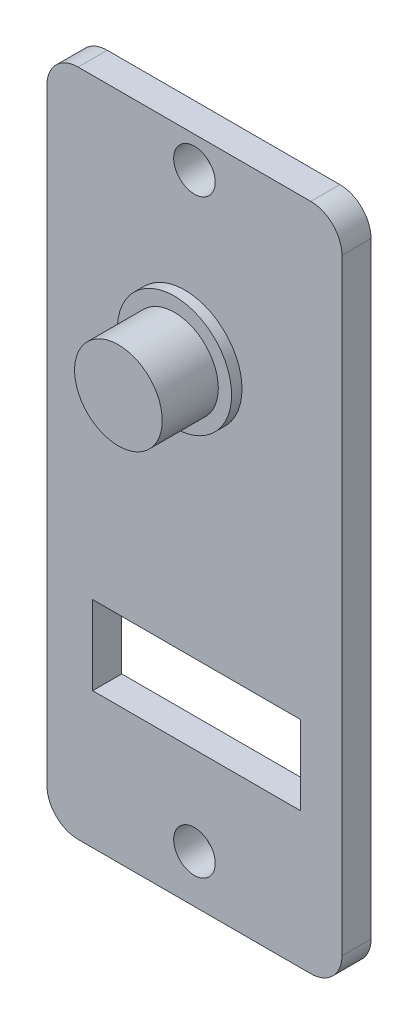
ISO-10303-21;
HEADER;
FILE_DESCRIPTION(('STEP AP214'),'2;1');
FILE_NAME('part.step','',(''),(''),'','','');
FILE_SCHEMA(('AUTOMOTIVE_DESIGN { 1 0 10303 214 1 1 1 1 }'));
ENDSEC;
DATA;
#1=APPLICATION_CONTEXT('core data for automotive mechanical design processes');
#2=APPLICATION_PROTOCOL_DEFINITION('international standard','automotive_design',2000,#1);
#3=PRODUCT_CONTEXT('',#1,'mechanical');
#4=PRODUCT('Part','Part','',(#3));
#5=PRODUCT_RELATED_PRODUCT_CATEGORY('part','',(#4));
#6=PRODUCT_DEFINITION_FORMATION('','',#4);
#7=PRODUCT_DEFINITION_CONTEXT('part definition',#1,'design');
#8=PRODUCT_DEFINITION('design','',#6,#7);
#9=PRODUCT_DEFINITION_SHAPE('','',#8);
#10=(LENGTH_UNIT() NAMED_UNIT(*) SI_UNIT(.MILLI.,.METRE.));
#11=(NAMED_UNIT(*) PLANE_ANGLE_UNIT() SI_UNIT($,.RADIAN.));
#12=(NAMED_UNIT(*) SI_UNIT($,.STERADIAN.) SOLID_ANGLE_UNIT());
#13=UNCERTAINTY_MEASURE_WITH_UNIT(LENGTH_MEASURE(1.E-05),#10,'distance_accuracy_value','');
#14=(GEOMETRIC_REPRESENTATION_CONTEXT(3) GLOBAL_UNCERTAINTY_ASSIGNED_CONTEXT((#13)) GLOBAL_UNIT_ASSIGNED_CONTEXT((#10,
#11,#12)) REPRESENTATION_CONTEXT('',''));
#15=CARTESIAN_POINT('',(0.,0.,0.));
#16=DIRECTION('',(0.,0.,1.));
#17=DIRECTION('',(1.,0.,0.));
#18=AXIS2_PLACEMENT_3D('',#15,#16,#17);
#19=CARTESIAN_POINT('',(-106.694153380275,235.753192448117,6.4));
#20=DIRECTION('',(1.,0.,0.));
#21=DIRECTION('',(0.,0.,-1.));
#22=AXIS2_PLACEMENT_3D('',#19,#20,#21);
#23=PLANE('',#22);
#24=DIRECTION('',(0.,-1.,0.));
#25=VECTOR('',#24,1.);
#26=CARTESIAN_POINT('',(-106.694153380275,235.753192448117,5.));
#27=LINE('',#26,#25);
#28=CARTESIAN_POINT('',(-106.694153380275,234.253192448117,5.));
#29=VERTEX_POINT('',#28);
#30=CARTESIAN_POINT('',(-106.694153380275,205.053192448117,5.));
#31=VERTEX_POINT('',#30);
#32=EDGE_CURVE('E188',#29,#31,#27,.T.);
#33=ORIENTED_EDGE('',*,*,#32,.T.);
#34=DIRECTION('',(0.,0.,-1.));
#35=VECTOR('',#34,1.);
#36=CARTESIAN_POINT('',(-106.694153380275,205.053192448117,6.4));
#37=LINE('',#36,#35);
#38=CARTESIAN_POINT('',(-106.694153380275,205.053192448117,6.4));
#39=VERTEX_POINT('',#38);
#40=EDGE_CURVE('E214',#31,#39,#37,.F.);
#41=ORIENTED_EDGE('',*,*,#40,.T.);
#42=DIRECTION('',(0.,-1.,0.));
#43=VECTOR('',#42,1.);
#44=CARTESIAN_POINT('',(-106.694153380275,235.753192448117,6.4));
#45=LINE('',#44,#43);
#46=CARTESIAN_POINT('',(-106.694153380275,234.253192448117,6.4));
#47=VERTEX_POINT('',#46);
#48=EDGE_CURVE('E176',#47,#39,#45,.T.);
#49=ORIENTED_EDGE('',*,*,#48,.F.);
#50=DIRECTION('',(0.,0.,-1.));
#51=VECTOR('',#50,1.);
#52=CARTESIAN_POINT('',(-106.694153380275,234.253192448117,6.4));
#53=LINE('',#52,#51);
#54=EDGE_CURVE('E211',#47,#29,#53,.T.);
#55=ORIENTED_EDGE('',*,*,#54,.T.);
#56=EDGE_LOOP('',(#33,#41,#49,#55));
#57=FACE_BOUND('',#56,.T.);
#58=ADVANCED_FACE('F38',(#57),#23,.F.);
#59=CARTESIAN_POINT('',(-106.694153380275,203.553192448117,6.4));
#60=DIRECTION('',(0.,1.,0.));
#61=DIRECTION('',(0.,0.,1.));
#62=AXIS2_PLACEMENT_3D('',#59,#60,#61);
#63=PLANE('',#62);
#64=DIRECTION('',(1.,0.,0.));
#65=VECTOR('',#64,1.);
#66=CARTESIAN_POINT('',(-106.694153380275,203.553192448117,6.4));
#67=LINE('',#66,#65);
#68=CARTESIAN_POINT('',(-105.194153380275,203.553192448117,6.4));
#69=VERTEX_POINT('',#68);
#70=CARTESIAN_POINT('',(-93.9941533802748,203.553192448117,6.4));
#71=VERTEX_POINT('',#70);
#72=EDGE_CURVE('E179',#69,#71,#67,.T.);
#73=ORIENTED_EDGE('',*,*,#72,.F.);
#74=DIRECTION('',(0.,0.,-1.));
#75=VECTOR('',#74,1.);
#76=CARTESIAN_POINT('',(-105.194153380275,203.553192448117,6.4));
#77=LINE('',#76,#75);
#78=CARTESIAN_POINT('',(-105.194153380275,203.553192448117,5.));
#79=VERTEX_POINT('',#78);
#80=EDGE_CURVE('E200',#69,#79,#77,.T.);
#81=ORIENTED_EDGE('',*,*,#80,.T.);
#82=DIRECTION('',(1.,0.,0.));
#83=VECTOR('',#82,1.);
#84=CARTESIAN_POINT('',(-106.694153380275,203.553192448117,5.));
#85=LINE('',#84,#83);
#86=CARTESIAN_POINT('',(-93.9941533802748,203.553192448117,5.));
#87=VERTEX_POINT('',#86);
#88=EDGE_CURVE('E191',#79,#87,#85,.T.);
#89=ORIENTED_EDGE('',*,*,#88,.T.);
#90=DIRECTION('',(0.,0.,-1.));
#91=VECTOR('',#90,1.);
#92=CARTESIAN_POINT('',(-93.9941533802748,203.553192448117,6.4));
#93=LINE('',#92,#91);
#94=EDGE_CURVE('E187',#87,#71,#93,.F.);
#95=ORIENTED_EDGE('',*,*,#94,.T.);
#96=EDGE_LOOP('',(#73,#81,#89,#95));
#97=FACE_BOUND('',#96,.T.);
#98=ADVANCED_FACE('F256',(#97),#63,.F.);
#99=CARTESIAN_POINT('',(-92.4941533802748,235.753192448117,6.4));
#100=DIRECTION('',(-1.,0.,0.));
#101=DIRECTION('',(0.,0.,1.));
#102=AXIS2_PLACEMENT_3D('',#99,#100,#101);
#103=PLANE('',#102);
#104=DIRECTION('',(0.,1.,0.));
#105=VECTOR('',#104,1.);
#106=CARTESIAN_POINT('',(-92.4941533802748,235.753192448117,6.4));
#107=LINE('',#106,#105);
#108=CARTESIAN_POINT('',(-92.4941533802748,205.053192448117,6.4));
#109=VERTEX_POINT('',#108);
#110=CARTESIAN_POINT('',(-92.4941533802748,234.253192448117,6.4));
#111=VERTEX_POINT('',#110);
#112=EDGE_CURVE('E183',#109,#111,#107,.T.);
#113=ORIENTED_EDGE('',*,*,#112,.F.);
#114=DIRECTION('',(0.,0.,-1.));
#115=VECTOR('',#114,1.);
#116=CARTESIAN_POINT('',(-92.4941533802748,205.053192448117,6.4));
#117=LINE('',#116,#115);
#118=CARTESIAN_POINT('',(-92.4941533802748,205.053192448117,5.));
#119=VERTEX_POINT('',#118);
#120=EDGE_CURVE('E225',#109,#119,#117,.T.);
#121=ORIENTED_EDGE('',*,*,#120,.T.);
#122=DIRECTION('',(0.,1.,0.));
#123=VECTOR('',#122,1.);
#124=CARTESIAN_POINT('',(-92.4941533802748,235.753192448117,5.));
#125=LINE('',#124,#123);
#126=CARTESIAN_POINT('',(-92.4941533802748,234.253192448117,5.));
#127=VERTEX_POINT('',#126);
#128=EDGE_CURVE('E195',#119,#127,#125,.T.);
#129=ORIENTED_EDGE('',*,*,#128,.T.);
#130=DIRECTION('',(0.,0.,-1.));
#131=VECTOR('',#130,1.);
#132=CARTESIAN_POINT('',(-92.4941533802748,234.253192448117,6.4));
#133=LINE('',#132,#131);
#134=EDGE_CURVE('E223',#127,#111,#133,.F.);
#135=ORIENTED_EDGE('',*,*,#134,.T.);
#136=EDGE_LOOP('',(#113,#121,#129,#135));
#137=FACE_BOUND('',#136,.T.);
#138=ADVANCED_FACE('F232',(#137),#103,.F.);
#139=CARTESIAN_POINT('',(-106.694153380275,235.753192448117,6.4));
#140=DIRECTION('',(0.,-1.,0.));
#141=DIRECTION('',(0.,0.,-1.));
#142=AXIS2_PLACEMENT_3D('',#139,#140,#141);
#143=PLANE('',#142);
#144=DIRECTION('',(-1.,0.,0.));
#145=VECTOR('',#144,1.);
#146=CARTESIAN_POINT('',(-106.694153380275,235.753192448117,6.4));
#147=LINE('',#146,#145);
#148=CARTESIAN_POINT('',(-93.9941533802748,235.753192448117,6.4));
#149=VERTEX_POINT('',#148);
#150=CARTESIAN_POINT('',(-105.194153380275,235.753192448117,6.4));
#151=VERTEX_POINT('',#150);
#152=EDGE_CURVE('E185',#149,#151,#147,.T.);
#153=ORIENTED_EDGE('',*,*,#152,.F.);
#154=DIRECTION('',(0.,0.,-1.));
#155=VECTOR('',#154,1.);
#156=CARTESIAN_POINT('',(-93.9941533802748,235.753192448117,6.4));
#157=LINE('',#156,#155);
#158=CARTESIAN_POINT('',(-93.9941533802748,235.753192448117,5.));
#159=VERTEX_POINT('',#158);
#160=EDGE_CURVE('E11',#149,#159,#157,.T.);
#161=ORIENTED_EDGE('',*,*,#160,.T.);
#162=DIRECTION('',(-1.,0.,0.));
#163=VECTOR('',#162,1.);
#164=CARTESIAN_POINT('',(-106.694153380275,235.753192448117,5.));
#165=LINE('',#164,#163);
#166=CARTESIAN_POINT('',(-105.194153380275,235.753192448117,5.));
#167=VERTEX_POINT('',#166);
#168=EDGE_CURVE('E180',#159,#167,#165,.T.);
#169=ORIENTED_EDGE('',*,*,#168,.T.);
#170=DIRECTION('',(0.,0.,-1.));
#171=VECTOR('',#170,1.);
#172=CARTESIAN_POINT('',(-105.194153380275,235.753192448117,6.4));
#173=LINE('',#172,#171);
#174=EDGE_CURVE('E47',#167,#151,#173,.F.);
#175=ORIENTED_EDGE('',*,*,#174,.T.);
#176=EDGE_LOOP('',(#153,#161,#169,#175));
#177=FACE_BOUND('',#176,.T.);
#178=ADVANCED_FACE('F241',(#177),#143,.F.);
#179=CARTESIAN_POINT('',(0.,0.,6.4));
#180=DIRECTION('',(0.,0.,1.));
#181=DIRECTION('',(1.,0.,0.));
#182=AXIS2_PLACEMENT_3D('',#179,#180,#181);
#183=PLANE('',#182);
#184=CARTESIAN_POINT('',(-100.056084645838,226.274312915593,6.4));
#185=DIRECTION('',(0.,0.,1.));
#186=DIRECTION('',(1.,0.,0.));
#187=AXIS2_PLACEMENT_3D('',#184,#185,#186);
#188=CIRCLE('',#187,2.75000000000001);
#189=CARTESIAN_POINT('',(-97.3060846458382,226.274312915593,6.4));
#190=VERTEX_POINT('',#189);
#191=EDGE_CURVE('E326',#190,#190,#188,.T.);
#192=ORIENTED_EDGE('',*,*,#191,.F.);
#193=EDGE_LOOP('',(#192));
#194=FACE_BOUND('',#193,.T.);
#195=CARTESIAN_POINT('',(-99.5941533802748,234.253192448117,6.4));
#196=DIRECTION('',(0.,0.,1.));
#197=DIRECTION('',(1.,0.,0.));
#198=AXIS2_PLACEMENT_3D('',#195,#196,#197);
#199=CIRCLE('',#198,1.00000000000001);
#200=CARTESIAN_POINT('',(-98.5941533802748,234.253192448117,6.4));
#201=VERTEX_POINT('',#200);
#202=EDGE_CURVE('E335',#201,#201,#199,.T.);
#203=ORIENTED_EDGE('',*,*,#202,.F.);
#204=EDGE_LOOP('',(#203));
#205=FACE_BOUND('',#204,.T.);
#206=CARTESIAN_POINT('',(-99.5941533802748,205.853192448117,6.4));
#207=DIRECTION('',(0.,0.,1.));
#208=DIRECTION('',(1.,0.,0.));
#209=AXIS2_PLACEMENT_3D('',#206,#207,#208);
#210=CIRCLE('',#209,0.999999999999998);
#211=CARTESIAN_POINT('',(-98.5941533802748,205.853192448117,6.4));
#212=VERTEX_POINT('',#211);
#213=EDGE_CURVE('E160',#212,#212,#210,.T.);
#214=ORIENTED_EDGE('',*,*,#213,.F.);
#215=EDGE_LOOP('',(#214));
#216=FACE_BOUND('',#215,.T.);
#217=DIRECTION('',(0.,-1.,0.));
#218=VECTOR('',#217,1.);
#219=CARTESIAN_POINT('',(-104.494153380275,213.903192448117,6.4));
#220=LINE('',#219,#218);
#221=CARTESIAN_POINT('',(-104.494153380275,213.903192448117,6.4));
#222=VERTEX_POINT('',#221);
#223=CARTESIAN_POINT('',(-104.494153380275,210.103192448117,6.4));
#224=VERTEX_POINT('',#223);
#225=EDGE_CURVE('E136',#222,#224,#220,.T.);
#226=ORIENTED_EDGE('',*,*,#225,.F.);
#227=DIRECTION('',(-1.,0.,0.));
#228=VECTOR('',#227,1.);
#229=CARTESIAN_POINT('',(-104.494153380275,213.903192448117,6.4));
#230=LINE('',#229,#228);
#231=CARTESIAN_POINT('',(-94.4941533802748,213.903192448117,6.4));
#232=VERTEX_POINT('',#231);
#233=EDGE_CURVE('E154',#232,#222,#230,.T.);
#234=ORIENTED_EDGE('',*,*,#233,.F.);
#235=DIRECTION('',(0.,1.,0.));
#236=VECTOR('',#235,1.);
#237=CARTESIAN_POINT('',(-94.4941533802748,213.903192448117,6.4));
#238=LINE('',#237,#236);
#239=CARTESIAN_POINT('',(-94.4941533802748,210.103192448117,6.4));
#240=VERTEX_POINT('',#239);
#241=EDGE_CURVE('E157',#240,#232,#238,.T.);
#242=ORIENTED_EDGE('',*,*,#241,.F.);
#243=DIRECTION('',(1.,0.,0.));
#244=VECTOR('',#243,1.);
#245=CARTESIAN_POINT('',(-104.494153380275,210.103192448117,6.4));
#246=LINE('',#245,#244);
#247=EDGE_CURVE('E166',#224,#240,#246,.T.);
#248=ORIENTED_EDGE('',*,*,#247,.F.);
#249=EDGE_LOOP('',(#226,#234,#242,#248));
#250=FACE_BOUND('',#249,.T.);
#251=ORIENTED_EDGE('',*,*,#48,.T.);
#252=CARTESIAN_POINT('',(-105.194153380275,205.053192448117,6.4));
#253=DIRECTION('',(0.,0.,1.));
#254=DIRECTION('',(1.,0.,0.));
#255=AXIS2_PLACEMENT_3D('',#252,#253,#254);
#256=CIRCLE('',#255,1.5);
#257=EDGE_CURVE('E221',#39,#69,#256,.T.);
#258=ORIENTED_EDGE('',*,*,#257,.T.);
#259=ORIENTED_EDGE('',*,*,#72,.T.);
#260=CARTESIAN_POINT('',(-93.9941533802748,205.053192448117,6.4));
#261=DIRECTION('',(0.,0.,1.));
#262=DIRECTION('',(1.,0.,0.));
#263=AXIS2_PLACEMENT_3D('',#260,#261,#262);
#264=CIRCLE('',#263,1.5);
#265=EDGE_CURVE('E219',#71,#109,#264,.T.);
#266=ORIENTED_EDGE('',*,*,#265,.T.);
#267=ORIENTED_EDGE('',*,*,#112,.T.);
#268=CARTESIAN_POINT('',(-93.9941533802748,234.253192448117,6.4));
#269=DIRECTION('',(0.,0.,1.));
#270=DIRECTION('',(1.,0.,0.));
#271=AXIS2_PLACEMENT_3D('',#268,#269,#270);
#272=CIRCLE('',#271,1.5);
#273=EDGE_CURVE('E60',#111,#149,#272,.T.);
#274=ORIENTED_EDGE('',*,*,#273,.T.);
#275=ORIENTED_EDGE('',*,*,#152,.T.);
#276=CARTESIAN_POINT('',(-105.194153380275,234.253192448117,6.4));
#277=DIRECTION('',(0.,0.,1.));
#278=DIRECTION('',(1.,0.,0.));
#279=AXIS2_PLACEMENT_3D('',#276,#277,#278);
#280=CIRCLE('',#279,1.5);
#281=EDGE_CURVE('E216',#151,#47,#280,.T.);
#282=ORIENTED_EDGE('',*,*,#281,.T.);
#283=EDGE_LOOP('',(#251,#258,#259,#266,#267,#274,#275,#282));
#284=FACE_BOUND('',#283,.T.);
#285=ADVANCED_FACE('F243',(#194,#205,#216,#250,#284),#183,.T.);
#286=CARTESIAN_POINT('',(0.,0.,5.));
#287=DIRECTION('',(0.,0.,1.));
#288=DIRECTION('',(1.,0.,0.));
#289=AXIS2_PLACEMENT_3D('',#286,#287,#288);
#290=PLANE('',#289);
#291=CARTESIAN_POINT('',(-99.5941533802748,234.253192448117,5.));
#292=DIRECTION('',(0.,0.,1.));
#293=DIRECTION('',(1.,0.,0.));
#294=AXIS2_PLACEMENT_3D('',#291,#292,#293);
#295=CIRCLE('',#294,1.00000000000001);
#296=CARTESIAN_POINT('',(-98.5941533802748,234.253192448117,5.));
#297=VERTEX_POINT('',#296);
#298=EDGE_CURVE('E192',#297,#297,#295,.T.);
#299=ORIENTED_EDGE('',*,*,#298,.T.);
#300=EDGE_LOOP('',(#299));
#301=FACE_BOUND('',#300,.T.);
#302=CARTESIAN_POINT('',(-99.5941533802748,205.853192448117,5.));
#303=DIRECTION('',(0.,0.,1.));
#304=DIRECTION('',(1.,0.,0.));
#305=AXIS2_PLACEMENT_3D('',#302,#303,#304);
#306=CIRCLE('',#305,0.999999999999998);
#307=CARTESIAN_POINT('',(-98.5941533802748,205.853192448117,5.));
#308=VERTEX_POINT('',#307);
#309=EDGE_CURVE('E337',#308,#308,#306,.T.);
#310=ORIENTED_EDGE('',*,*,#309,.T.);
#311=EDGE_LOOP('',(#310));
#312=FACE_BOUND('',#311,.T.);
#313=DIRECTION('',(-1.,0.,0.));
#314=VECTOR('',#313,1.);
#315=CARTESIAN_POINT('',(-104.494153380275,213.903192448117,5.));
#316=LINE('',#315,#314);
#317=CARTESIAN_POINT('',(-94.4941533802748,213.903192448117,5.));
#318=VERTEX_POINT('',#317);
#319=CARTESIAN_POINT('',(-104.494153380275,213.903192448117,5.));
#320=VERTEX_POINT('',#319);
#321=EDGE_CURVE('E141',#318,#320,#316,.T.);
#322=ORIENTED_EDGE('',*,*,#321,.T.);
#323=DIRECTION('',(0.,-1.,0.));
#324=VECTOR('',#323,1.);
#325=CARTESIAN_POINT('',(-104.494153380275,213.903192448117,5.));
#326=LINE('',#325,#324);
#327=CARTESIAN_POINT('',(-104.494153380275,210.103192448117,5.));
#328=VERTEX_POINT('',#327);
#329=EDGE_CURVE('E133',#320,#328,#326,.T.);
#330=ORIENTED_EDGE('',*,*,#329,.T.);
#331=DIRECTION('',(1.,0.,0.));
#332=VECTOR('',#331,1.);
#333=CARTESIAN_POINT('',(-104.494153380275,210.103192448117,5.));
#334=LINE('',#333,#332);
#335=CARTESIAN_POINT('',(-94.4941533802748,210.103192448117,5.));
#336=VERTEX_POINT('',#335);
#337=EDGE_CURVE('E145',#328,#336,#334,.T.);
#338=ORIENTED_EDGE('',*,*,#337,.T.);
#339=DIRECTION('',(0.,1.,0.));
#340=VECTOR('',#339,1.);
#341=CARTESIAN_POINT('',(-94.4941533802748,213.903192448117,5.));
#342=LINE('',#341,#340);
#343=EDGE_CURVE('E149',#336,#318,#342,.T.);
#344=ORIENTED_EDGE('',*,*,#343,.T.);
#345=EDGE_LOOP('',(#322,#330,#338,#344));
#346=FACE_BOUND('',#345,.T.);
#347=ORIENTED_EDGE('',*,*,#88,.F.);
#348=CARTESIAN_POINT('',(-105.194153380275,205.053192448117,5.));
#349=DIRECTION('',(0.,0.,1.));
#350=DIRECTION('',(1.,0.,0.));
#351=AXIS2_PLACEMENT_3D('',#348,#349,#350);
#352=CIRCLE('',#351,1.5);
#353=EDGE_CURVE('E209',#79,#31,#352,.F.);
#354=ORIENTED_EDGE('',*,*,#353,.T.);
#355=ORIENTED_EDGE('',*,*,#32,.F.);
#356=CARTESIAN_POINT('',(-105.194153380275,234.253192448117,5.));
#357=DIRECTION('',(0.,0.,1.));
#358=DIRECTION('',(1.,0.,0.));
#359=AXIS2_PLACEMENT_3D('',#356,#357,#358);
#360=CIRCLE('',#359,1.5);
#361=EDGE_CURVE('E203',#29,#167,#360,.F.);
#362=ORIENTED_EDGE('',*,*,#361,.T.);
#363=ORIENTED_EDGE('',*,*,#168,.F.);
#364=CARTESIAN_POINT('',(-93.9941533802748,234.253192448117,5.));
#365=DIRECTION('',(0.,0.,1.));
#366=DIRECTION('',(1.,0.,0.));
#367=AXIS2_PLACEMENT_3D('',#364,#365,#366);
#368=CIRCLE('',#367,1.5);
#369=EDGE_CURVE('E205',#159,#127,#368,.F.);
#370=ORIENTED_EDGE('',*,*,#369,.T.);
#371=ORIENTED_EDGE('',*,*,#128,.F.);
#372=CARTESIAN_POINT('',(-93.9941533802748,205.053192448117,5.));
#373=DIRECTION('',(0.,0.,1.));
#374=DIRECTION('',(1.,0.,0.));
#375=AXIS2_PLACEMENT_3D('',#372,#373,#374);
#376=CIRCLE('',#375,1.5);
#377=EDGE_CURVE('E207',#119,#87,#376,.F.);
#378=ORIENTED_EDGE('',*,*,#377,.T.);
#379=EDGE_LOOP('',(#347,#354,#355,#362,#363,#370,#371,#378));
#380=FACE_BOUND('',#379,.T.);
#381=ADVANCED_FACE('F151',(#301,#312,#346,#380),#290,.F.);
#382=CARTESIAN_POINT('',(-104.494153380275,213.903192448117,5.));
#383=DIRECTION('',(-1.,0.,0.));
#384=DIRECTION('',(0.,0.,1.));
#385=AXIS2_PLACEMENT_3D('',#382,#383,#384);
#386=PLANE('',#385);
#387=ORIENTED_EDGE('',*,*,#225,.T.);
#388=DIRECTION('',(0.,0.,1.));
#389=VECTOR('',#388,1.);
#390=CARTESIAN_POINT('',(-104.494153380275,210.103192448117,5.));
#391=LINE('',#390,#389);
#392=EDGE_CURVE('E129',#328,#224,#391,.T.);
#393=ORIENTED_EDGE('',*,*,#392,.F.);
#394=ORIENTED_EDGE('',*,*,#329,.F.);
#395=DIRECTION('',(0.,0.,1.));
#396=VECTOR('',#395,1.);
#397=CARTESIAN_POINT('',(-104.494153380275,213.903192448117,5.));
#398=LINE('',#397,#396);
#399=EDGE_CURVE('E171',#320,#222,#398,.T.);
#400=ORIENTED_EDGE('',*,*,#399,.T.);
#401=EDGE_LOOP('',(#387,#393,#394,#400));
#402=FACE_BOUND('',#401,.T.);
#403=ADVANCED_FACE('F131',(#402),#386,.F.);
#404=CARTESIAN_POINT('',(-104.494153380275,213.903192448117,5.));
#405=DIRECTION('',(0.,1.,0.));
#406=DIRECTION('',(-1.,0.,0.));
#407=AXIS2_PLACEMENT_3D('',#404,#405,#406);
#408=PLANE('',#407);
#409=ORIENTED_EDGE('',*,*,#233,.T.);
#410=ORIENTED_EDGE('',*,*,#399,.F.);
#411=ORIENTED_EDGE('',*,*,#321,.F.);
#412=DIRECTION('',(0.,0.,1.));
#413=VECTOR('',#412,1.);
#414=CARTESIAN_POINT('',(-94.4941533802748,213.903192448117,5.));
#415=LINE('',#414,#413);
#416=EDGE_CURVE('E173',#318,#232,#415,.T.);
#417=ORIENTED_EDGE('',*,*,#416,.T.);
#418=EDGE_LOOP('',(#409,#410,#411,#417));
#419=FACE_BOUND('',#418,.T.);
#420=ADVANCED_FACE('F286',(#419),#408,.F.);
#421=CARTESIAN_POINT('',(-94.4941533802748,213.903192448117,5.));
#422=DIRECTION('',(1.,0.,0.));
#423=DIRECTION('',(0.,0.,-1.));
#424=AXIS2_PLACEMENT_3D('',#421,#422,#423);
#425=PLANE('',#424);
#426=ORIENTED_EDGE('',*,*,#241,.T.);
#427=ORIENTED_EDGE('',*,*,#416,.F.);
#428=ORIENTED_EDGE('',*,*,#343,.F.);
#429=DIRECTION('',(0.,0.,1.));
#430=VECTOR('',#429,1.);
#431=CARTESIAN_POINT('',(-94.4941533802748,210.103192448117,5.));
#432=LINE('',#431,#430);
#433=EDGE_CURVE('E140',#336,#240,#432,.T.);
#434=ORIENTED_EDGE('',*,*,#433,.T.);
#435=EDGE_LOOP('',(#426,#427,#428,#434));
#436=FACE_BOUND('',#435,.T.);
#437=ADVANCED_FACE('F290',(#436),#425,.F.);
#438=CARTESIAN_POINT('',(-104.494153380275,210.103192448117,5.));
#439=DIRECTION('',(0.,-1.,0.));
#440=DIRECTION('',(0.,0.,-1.));
#441=AXIS2_PLACEMENT_3D('',#438,#439,#440);
#442=PLANE('',#441);
#443=ORIENTED_EDGE('',*,*,#247,.T.);
#444=ORIENTED_EDGE('',*,*,#433,.F.);
#445=ORIENTED_EDGE('',*,*,#337,.F.);
#446=ORIENTED_EDGE('',*,*,#392,.T.);
#447=EDGE_LOOP('',(#443,#444,#445,#446));
#448=FACE_BOUND('',#447,.T.);
#449=ADVANCED_FACE('F146',(#448),#442,.F.);
#450=CARTESIAN_POINT('',(-99.5941533802748,205.853192448117,5.));
#451=DIRECTION('',(0.,0.,1.));
#452=DIRECTION('',(1.,0.,0.));
#453=AXIS2_PLACEMENT_3D('',#450,#451,#452);
#454=CYLINDRICAL_SURFACE('',#453,0.999999999999998);
#455=ORIENTED_EDGE('',*,*,#309,.F.);
#456=EDGE_LOOP('',(#455));
#457=FACE_BOUND('',#456,.T.);
#458=ORIENTED_EDGE('',*,*,#213,.T.);
#459=EDGE_LOOP('',(#458));
#460=FACE_BOUND('',#459,.T.);
#461=ADVANCED_FACE('F289',(#457,#460),#454,.F.);
#462=CARTESIAN_POINT('',(-99.5941533802748,234.253192448117,5.));
#463=DIRECTION('',(0.,0.,1.));
#464=DIRECTION('',(1.,0.,0.));
#465=AXIS2_PLACEMENT_3D('',#462,#463,#464);
#466=CYLINDRICAL_SURFACE('',#465,1.00000000000001);
#467=ORIENTED_EDGE('',*,*,#298,.F.);
#468=EDGE_LOOP('',(#467));
#469=FACE_BOUND('',#468,.T.);
#470=ORIENTED_EDGE('',*,*,#202,.T.);
#471=EDGE_LOOP('',(#470));
#472=FACE_BOUND('',#471,.T.);
#473=ADVANCED_FACE('F265',(#469,#472),#466,.F.);
#474=CARTESIAN_POINT('',(-105.194153380275,205.053192448117,6.4));
#475=DIRECTION('',(0.,0.,-1.));
#476=DIRECTION('',(-1.,0.,0.));
#477=AXIS2_PLACEMENT_3D('',#474,#475,#476);
#478=CYLINDRICAL_SURFACE('',#477,1.5);
#479=ORIENTED_EDGE('',*,*,#257,.F.);
#480=ORIENTED_EDGE('',*,*,#40,.F.);
#481=ORIENTED_EDGE('',*,*,#353,.F.);
#482=ORIENTED_EDGE('',*,*,#80,.F.);
#483=EDGE_LOOP('',(#479,#480,#481,#482));
#484=FACE_BOUND('',#483,.T.);
#485=ADVANCED_FACE('F253',(#484),#478,.T.);
#486=CARTESIAN_POINT('',(-93.9941533802748,205.053192448117,6.4));
#487=DIRECTION('',(0.,0.,-1.));
#488=DIRECTION('',(-1.,0.,0.));
#489=AXIS2_PLACEMENT_3D('',#486,#487,#488);
#490=CYLINDRICAL_SURFACE('',#489,1.5);
#491=ORIENTED_EDGE('',*,*,#265,.F.);
#492=ORIENTED_EDGE('',*,*,#94,.F.);
#493=ORIENTED_EDGE('',*,*,#377,.F.);
#494=ORIENTED_EDGE('',*,*,#120,.F.);
#495=EDGE_LOOP('',(#491,#492,#493,#494));
#496=FACE_BOUND('',#495,.T.);
#497=ADVANCED_FACE('F258',(#496),#490,.T.);
#498=CARTESIAN_POINT('',(-93.9941533802748,234.253192448117,6.4));
#499=DIRECTION('',(0.,0.,-1.));
#500=DIRECTION('',(-1.,0.,0.));
#501=AXIS2_PLACEMENT_3D('',#498,#499,#500);
#502=CYLINDRICAL_SURFACE('',#501,1.5);
#503=ORIENTED_EDGE('',*,*,#273,.F.);
#504=ORIENTED_EDGE('',*,*,#134,.F.);
#505=ORIENTED_EDGE('',*,*,#369,.F.);
#506=ORIENTED_EDGE('',*,*,#160,.F.);
#507=EDGE_LOOP('',(#503,#504,#505,#506));
#508=FACE_BOUND('',#507,.T.);
#509=ADVANCED_FACE('F240',(#508),#502,.T.);
#510=CARTESIAN_POINT('',(-105.194153380275,234.253192448117,6.4));
#511=DIRECTION('',(0.,0.,-1.));
#512=DIRECTION('',(-1.,0.,0.));
#513=AXIS2_PLACEMENT_3D('',#510,#511,#512);
#514=CYLINDRICAL_SURFACE('',#513,1.5);
#515=ORIENTED_EDGE('',*,*,#281,.F.);
#516=ORIENTED_EDGE('',*,*,#174,.F.);
#517=ORIENTED_EDGE('',*,*,#361,.F.);
#518=ORIENTED_EDGE('',*,*,#54,.F.);
#519=EDGE_LOOP('',(#515,#516,#517,#518));
#520=FACE_BOUND('',#519,.T.);
#521=ADVANCED_FACE('F40',(#520),#514,.T.);
#522=CARTESIAN_POINT('',(-100.056084645838,226.274312915593,6.9));
#523=DIRECTION('',(0.,0.,-1.));
#524=DIRECTION('',(-1.,0.,0.));
#525=AXIS2_PLACEMENT_3D('',#522,#523,#524);
#526=CYLINDRICAL_SURFACE('',#525,2.75000000000001);
#527=CARTESIAN_POINT('',(-100.056084645838,226.274312915593,6.9));
#528=DIRECTION('',(0.,0.,1.));
#529=DIRECTION('',(1.,0.,0.));
#530=AXIS2_PLACEMENT_3D('',#527,#528,#529);
#531=CIRCLE('',#530,2.75000000000001);
#532=CARTESIAN_POINT('',(-97.3060846458382,226.274312915593,6.9));
#533=VERTEX_POINT('',#532);
#534=EDGE_CURVE('E325',#533,#533,#531,.T.);
#535=ORIENTED_EDGE('',*,*,#534,.F.);
#536=EDGE_LOOP('',(#535));
#537=FACE_BOUND('',#536,.T.);
#538=ORIENTED_EDGE('',*,*,#191,.T.);
#539=EDGE_LOOP('',(#538));
#540=FACE_BOUND('',#539,.T.);
#541=ADVANCED_FACE('F312',(#537,#540),#526,.T.);
#542=CARTESIAN_POINT('',(-100.056084645838,226.274312915593,6.9));
#543=DIRECTION('',(0.,0.,1.));
#544=DIRECTION('',(1.,0.,0.));
#545=AXIS2_PLACEMENT_3D('',#542,#543,#544);
#546=PLANE('',#545);
#547=CARTESIAN_POINT('',(-100.055672153339,226.235056065854,6.9));
#548=DIRECTION('',(0.,0.,1.));
#549=DIRECTION('',(1.,0.,0.));
#550=AXIS2_PLACEMENT_3D('',#547,#548,#549);
#551=CIRCLE('',#550,2.11);
#552=CARTESIAN_POINT('',(-97.9456721533392,226.235056065854,6.9));
#553=VERTEX_POINT('',#552);
#554=EDGE_CURVE('E42',#553,#553,#551,.T.);
#555=ORIENTED_EDGE('',*,*,#554,.F.);
#556=EDGE_LOOP('',(#555));
#557=FACE_BOUND('',#556,.T.);
#558=ORIENTED_EDGE('',*,*,#534,.T.);
#559=EDGE_LOOP('',(#558));
#560=FACE_BOUND('',#559,.T.);
#561=ADVANCED_FACE('F310',(#557,#560),#546,.T.);
#562=CARTESIAN_POINT('',(-100.055672153339,226.235056065854,9.6));
#563=DIRECTION('',(0.,0.,1.));
#564=DIRECTION('',(1.,0.,0.));
#565=AXIS2_PLACEMENT_3D('',#562,#563,#564);
#566=PLANE('',#565);
#567=CARTESIAN_POINT('',(-100.055672153339,226.235056065854,9.6));
#568=DIRECTION('',(0.,0.,1.));
#569=DIRECTION('',(1.,0.,0.));
#570=AXIS2_PLACEMENT_3D('',#567,#568,#569);
#571=CIRCLE('',#570,2.11);
#572=CARTESIAN_POINT('',(-97.9456721533392,226.235056065854,9.6));
#573=VERTEX_POINT('',#572);
#574=EDGE_CURVE('E167',#573,#573,#571,.T.);
#575=ORIENTED_EDGE('',*,*,#574,.T.);
#576=EDGE_LOOP('',(#575));
#577=FACE_BOUND('',#576,.T.);
#578=ADVANCED_FACE('F306',(#577),#566,.T.);
#579=CARTESIAN_POINT('',(-100.055672153339,226.235056065854,9.6));
#580=DIRECTION('',(0.,0.,-1.));
#581=DIRECTION('',(-1.,0.,0.));
#582=AXIS2_PLACEMENT_3D('',#579,#580,#581);
#583=CYLINDRICAL_SURFACE('',#582,2.11);
#584=ORIENTED_EDGE('',*,*,#554,.T.);
#585=EDGE_LOOP('',(#584));
#586=FACE_BOUND('',#585,.T.);
#587=ORIENTED_EDGE('',*,*,#574,.F.);
#588=EDGE_LOOP('',(#587));
#589=FACE_BOUND('',#588,.T.);
#590=ADVANCED_FACE('F303',(#586,#589),#583,.T.);
#591=CLOSED_SHELL('',(#58,#98,#138,#178,#285,#381,#403,#420,#437,#449,#461,#473,#485,#497,#509,
#521,#541,#561,#578,#590));
#592=MANIFOLD_SOLID_BREP('B2',#591);
#593=ADVANCED_BREP_SHAPE_REPRESENTATION('',(#18,#592),#14);
#594=SHAPE_DEFINITION_REPRESENTATION(#9,#593);
ENDSEC;
END-ISO-10303-21;
